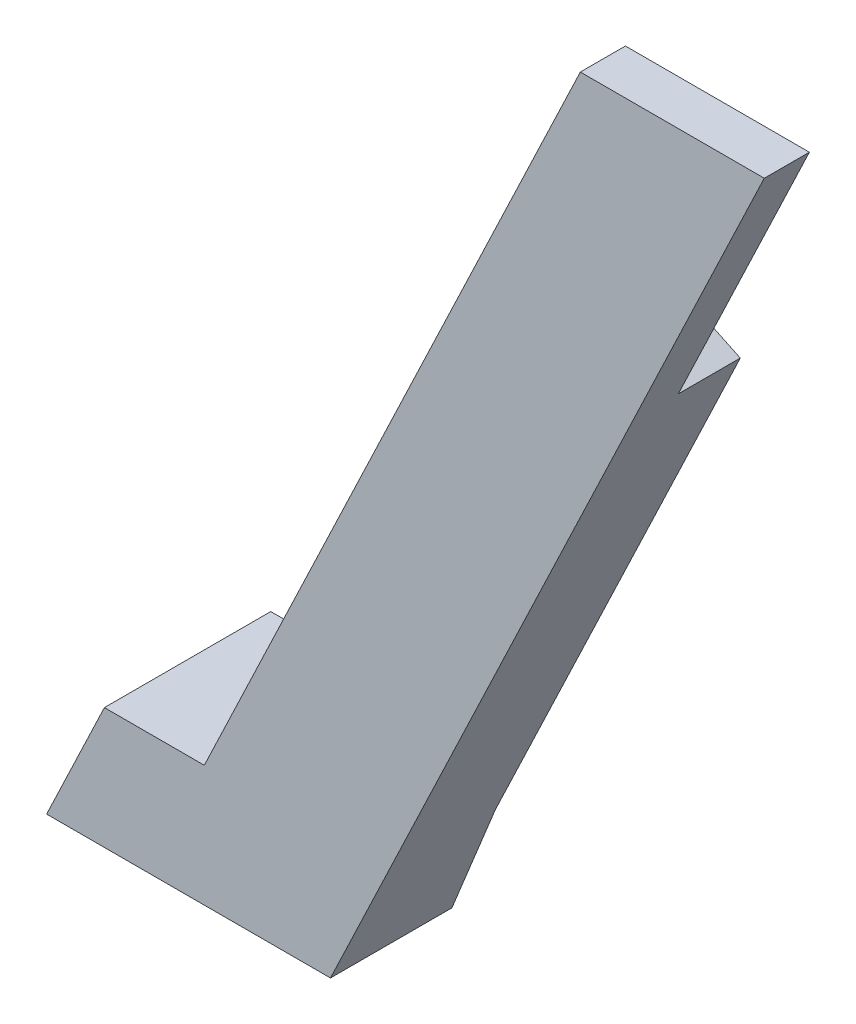
ISO-10303-21;
HEADER;
FILE_DESCRIPTION(('STEP AP214'),'2;1');
FILE_NAME('part.step','',(''),(''),'','','');
FILE_SCHEMA(('AUTOMOTIVE_DESIGN { 1 0 10303 214 1 1 1 1 }'));
ENDSEC;
DATA;
#1=APPLICATION_CONTEXT('core data for automotive mechanical design processes');
#2=APPLICATION_PROTOCOL_DEFINITION('international standard','automotive_design',2000,#1);
#3=PRODUCT_CONTEXT('',#1,'mechanical');
#4=PRODUCT('Part','Part','',(#3));
#5=PRODUCT_RELATED_PRODUCT_CATEGORY('part','',(#4));
#6=PRODUCT_DEFINITION_FORMATION('','',#4);
#7=PRODUCT_DEFINITION_CONTEXT('part definition',#1,'design');
#8=PRODUCT_DEFINITION('design','',#6,#7);
#9=PRODUCT_DEFINITION_SHAPE('','',#8);
#10=(LENGTH_UNIT() NAMED_UNIT(*) SI_UNIT(.MILLI.,.METRE.));
#11=(NAMED_UNIT(*) PLANE_ANGLE_UNIT() SI_UNIT($,.RADIAN.));
#12=(NAMED_UNIT(*) SI_UNIT($,.STERADIAN.) SOLID_ANGLE_UNIT());
#13=UNCERTAINTY_MEASURE_WITH_UNIT(LENGTH_MEASURE(1.E-05),#10,'distance_accuracy_value','');
#14=(GEOMETRIC_REPRESENTATION_CONTEXT(3) GLOBAL_UNCERTAINTY_ASSIGNED_CONTEXT((#13)) GLOBAL_UNIT_ASSIGNED_CONTEXT((#10,
#11,#12)) REPRESENTATION_CONTEXT('',''));
#15=CARTESIAN_POINT('',(0.,0.,0.));
#16=DIRECTION('',(0.,0.,1.));
#17=DIRECTION('',(1.,0.,0.));
#18=AXIS2_PLACEMENT_3D('',#15,#16,#17);
#19=CARTESIAN_POINT('',(0.,0.,-4.));
#20=DIRECTION('',(0.,0.,1.));
#21=DIRECTION('',(1.,0.,0.));
#22=AXIS2_PLACEMENT_3D('',#19,#20,#21);
#23=PLANE('',#22);
#24=DIRECTION('',(0.902585284349863,-0.430511096808291,0.));
#25=VECTOR('',#24,1.);
#26=CARTESIAN_POINT('',(4.57342261183424,9.58837990276632,-4.));
#27=LINE('',#26,#25);
#28=CARTESIAN_POINT('',(-5.21888141705454,14.2590693332878,-4.));
#29=VERTEX_POINT('',#28);
#30=CARTESIAN_POINT('',(-0.164403824695319,11.8482071911614,-4.));
#31=VERTEX_POINT('',#30);
#32=EDGE_CURVE('E302',#29,#31,#27,.T.);
#33=ORIENTED_EDGE('',*,*,#32,.T.);
#34=DIRECTION('',(0.430511096808289,0.902585284349863,0.));
#35=VECTOR('',#34,1.);
#36=CARTESIAN_POINT('',(-4.73782643652955,2.25982728839507,-4.));
#37=LINE('',#36,#35);
#38=CARTESIAN_POINT('',(4.31291158211089,21.2350941484,-4.));
#39=VERTEX_POINT('',#38);
#40=EDGE_CURVE('E99',#31,#39,#37,.T.);
#41=ORIENTED_EDGE('',*,*,#40,.T.);
#42=DIRECTION('',(-0.902585284349863,0.430511096808291,0.));
#43=VECTOR('',#42,1.);
#44=CARTESIAN_POINT('',(9.05073801864047,18.9752668600049,-4.));
#45=LINE('',#44,#43);
#46=CARTESIAN_POINT('',(-0.741566010248357,23.6459562905264,-4.));
#47=VERTEX_POINT('',#46);
#48=EDGE_CURVE('E308',#39,#47,#45,.T.);
#49=ORIENTED_EDGE('',*,*,#48,.T.);
#50=DIRECTION('',(-0.430511096808287,-0.902585284349865,0.));
#51=VECTOR('',#50,1.);
#52=CARTESIAN_POINT('',(-9.79230402888876,4.67068943052144,-4.));
#53=LINE('',#52,#51);
#54=EDGE_CURVE('E301',#47,#29,#53,.T.);
#55=ORIENTED_EDGE('',*,*,#54,.T.);
#56=EDGE_LOOP('',(#33,#41,#49,#55));
#57=FACE_BOUND('',#56,.T.);
#58=DIRECTION('',(0.902585284349865,-0.430511096808287,0.));
#59=VECTOR('',#58,1.);
#60=CARTESIAN_POINT('',(3.28188932140938,6.88062404971684,-4.));
#61=LINE('',#60,#59);
#62=CARTESIAN_POINT('',(-8.81560558331229,12.6508331262096,-4.));
#63=VERTEX_POINT('',#62);
#64=CARTESIAN_POINT('',(1.25181873792912,7.84891804768718,-4.));
#65=VERTEX_POINT('',#64);
#66=EDGE_CURVE('E256',#63,#65,#61,.T.);
#67=ORIENTED_EDGE('',*,*,#66,.F.);
#68=DIRECTION('',(-0.43051109680829,-0.902585284349863,0.));
#69=VECTOR('',#68,1.);
#70=CARTESIAN_POINT('',(6.79806732335556,45.3855791169411,-4.));
#71=LINE('',#70,#69);
#72=CARTESIAN_POINT('',(6.79806732335556,45.3855791169411,-4.));
#73=VERTEX_POINT('',#72);
#74=EDGE_CURVE('E222',#73,#63,#71,.T.);
#75=ORIENTED_EDGE('',*,*,#74,.F.);
#76=DIRECTION('',(-1.,0.,0.));
#77=VECTOR('',#76,1.);
#78=CARTESIAN_POINT('',(6.79806732335556,45.3855791169411,-4.));
#79=LINE('',#78,#77);
#80=CARTESIAN_POINT('',(23.1199205917161,45.3855791169411,-4.));
#81=VERTEX_POINT('',#80);
#82=EDGE_CURVE('E227',#81,#73,#79,.T.);
#83=ORIENTED_EDGE('',*,*,#82,.F.);
#84=DIRECTION('',(0.430511096808289,0.902585284349863,0.));
#85=VECTOR('',#84,1.);
#86=CARTESIAN_POINT('',(-15.3714022019898,-35.3131573066409,-4.));
#87=LINE('',#86,#85);
#88=CARTESIAN_POINT('',(11.4902633590119,21.0034956861254,-4.));
#89=VERTEX_POINT('',#88);
#90=EDGE_CURVE('E217',#89,#81,#87,.T.);
#91=ORIENTED_EDGE('',*,*,#90,.F.);
#92=DIRECTION('',(0.902585284349863,-0.43051109680829,0.));
#93=VECTOR('',#92,1.);
#94=CARTESIAN_POINT('',(10.290994088802,21.5755177851323,-4.));
#95=LINE('',#94,#93);
#96=CARTESIAN_POINT('',(8.26092366574488,22.5438117065847,-4.));
#97=VERTEX_POINT('',#96);
#98=EDGE_CURVE('E259',#97,#89,#95,.T.);
#99=ORIENTED_EDGE('',*,*,#98,.F.);
#100=DIRECTION('',(0.430511106661755,0.902585279650001,0.));
#101=VECTOR('',#100,1.);
#102=CARTESIAN_POINT('',(-2.0300706480248,0.96829405596068,-4.));
#103=LINE('',#102,#101);
#104=EDGE_CURVE('E251',#65,#97,#103,.T.);
#105=ORIENTED_EDGE('',*,*,#104,.F.);
#106=EDGE_LOOP('',(#67,#75,#83,#91,#99,#105));
#107=FACE_BOUND('',#106,.T.);
#108=ADVANCED_FACE('F77',(#57,#107),#23,.F.);
#109=CARTESIAN_POINT('',(6.79806732335556,45.3855791169411,-4.));
#110=DIRECTION('',(0.,1.,0.));
#111=DIRECTION('',(0.,0.,1.));
#112=AXIS2_PLACEMENT_3D('',#109,#110,#111);
#113=PLANE('',#112);
#114=DIRECTION('',(-1.,0.,0.));
#115=VECTOR('',#114,1.);
#116=CARTESIAN_POINT('',(6.79806732335556,45.3855791169411,0.));
#117=LINE('',#116,#115);
#118=CARTESIAN_POINT('',(23.1199205917161,45.3855791169411,0.));
#119=VERTEX_POINT('',#118);
#120=CARTESIAN_POINT('',(6.79806732335556,45.3855791169411,0.));
#121=VERTEX_POINT('',#120);
#122=EDGE_CURVE('E231',#119,#121,#117,.T.);
#123=ORIENTED_EDGE('',*,*,#122,.F.);
#124=DIRECTION('',(0.,0.,1.));
#125=VECTOR('',#124,1.);
#126=CARTESIAN_POINT('',(23.1199205917161,45.3855791169411,-4.));
#127=LINE('',#126,#125);
#128=EDGE_CURVE('E206',#81,#119,#127,.T.);
#129=ORIENTED_EDGE('',*,*,#128,.F.);
#130=ORIENTED_EDGE('',*,*,#82,.T.);
#131=DIRECTION('',(0.,0.,1.));
#132=VECTOR('',#131,1.);
#133=CARTESIAN_POINT('',(6.79806732335556,45.3855791169411,-4.));
#134=LINE('',#133,#132);
#135=EDGE_CURVE('E216',#73,#121,#134,.T.);
#136=ORIENTED_EDGE('',*,*,#135,.T.);
#137=EDGE_LOOP('',(#123,#129,#130,#136));
#138=FACE_BOUND('',#137,.T.);
#139=ADVANCED_FACE('F79',(#138),#113,.T.);
#140=CARTESIAN_POINT('',(-15.3714022019898,-35.3131573066409,-4.));
#141=DIRECTION('',(0.902585284349863,-0.430511096808289,0.));
#142=DIRECTION('',(0.430511096808289,0.902585284349863,0.));
#143=AXIS2_PLACEMENT_3D('',#140,#141,#142);
#144=PLANE('',#143);
#145=DIRECTION('',(-0.428076885082601,-0.897481853337546,-0.10619088184859));
#146=VECTOR('',#145,1.);
#147=CARTESIAN_POINT('',(-15.0635706334285,-34.6677750019764,-10.6954381913424));
#148=LINE('',#147,#146);
#149=CARTESIAN_POINT('',(-10.2445179205198,-24.564420883059,-9.5));
#150=VERTEX_POINT('',#149);
#151=CARTESIAN_POINT('',(-15.3714022019898,-35.3131573066409,-10.7718004217395));
#152=VERTEX_POINT('',#151);
#153=EDGE_CURVE('E185',#150,#152,#148,.T.);
#154=ORIENTED_EDGE('',*,*,#153,.F.);
#155=DIRECTION('',(-0.430511096808289,-0.902585284349864,0.));
#156=VECTOR('',#155,1.);
#157=CARTESIAN_POINT('',(1.19926927021,-0.572022099006938,-9.50000000000001));
#158=LINE('',#157,#156);
#159=CARTESIAN_POINT('',(11.4902633590119,21.0034956861254,-9.50000000000001));
#160=VERTEX_POINT('',#159);
#161=EDGE_CURVE('E272',#160,#150,#158,.T.);
#162=ORIENTED_EDGE('',*,*,#161,.F.);
#163=DIRECTION('',(0.,0.,1.));
#164=VECTOR('',#163,1.);
#165=CARTESIAN_POINT('',(11.4902633590119,21.0034956861254,-87.3223205408676));
#166=LINE('',#165,#164);
#167=EDGE_CURVE('E257',#160,#89,#166,.T.);
#168=ORIENTED_EDGE('',*,*,#167,.T.);
#169=ORIENTED_EDGE('',*,*,#90,.T.);
#170=ORIENTED_EDGE('',*,*,#128,.T.);
#171=DIRECTION('',(0.430511096808289,0.902585284349863,0.));
#172=VECTOR('',#171,1.);
#173=CARTESIAN_POINT('',(-15.3714022019898,-35.3131573066409,0.));
#174=LINE('',#173,#172);
#175=CARTESIAN_POINT('',(-15.3714022019898,-35.3131573066409,0.));
#176=VERTEX_POINT('',#175);
#177=EDGE_CURVE('E205',#176,#119,#174,.T.);
#178=ORIENTED_EDGE('',*,*,#177,.F.);
#179=DIRECTION('',(0.,0.,1.));
#180=VECTOR('',#179,1.);
#181=CARTESIAN_POINT('',(-15.3714022019898,-35.3131573066409,-4.));
#182=LINE('',#181,#180);
#183=EDGE_CURVE('E198',#152,#176,#182,.T.);
#184=ORIENTED_EDGE('',*,*,#183,.F.);
#185=EDGE_LOOP('',(#154,#162,#168,#169,#170,#178,#184));
#186=FACE_BOUND('',#185,.T.);
#187=ADVANCED_FACE('F203',(#186),#144,.T.);
#188=CARTESIAN_POINT('',(-40.55668382301,-35.3131573066409,-4.));
#189=DIRECTION('',(0.,-1.,0.));
#190=DIRECTION('',(0.,0.,-1.));
#191=AXIS2_PLACEMENT_3D('',#188,#189,#190);
#192=PLANE('',#191);
#193=DIRECTION('',(-0.970582796133083,0.,-0.240767597177209));
#194=VECTOR('',#193,1.);
#195=CARTESIAN_POINT('',(-31.4486399349221,-35.3131573066409,-14.76));
#196=LINE('',#195,#194);
#197=CARTESIAN_POINT('',(-31.4486399349221,-35.313157306641,-14.76));
#198=VERTEX_POINT('',#197);
#199=EDGE_CURVE('E91',#152,#198,#196,.T.);
#200=ORIENTED_EDGE('',*,*,#199,.F.);
#201=ORIENTED_EDGE('',*,*,#183,.T.);
#202=DIRECTION('',(1.,0.,0.));
#203=VECTOR('',#202,1.);
#204=CARTESIAN_POINT('',(-40.55668382301,-35.3131573066409,0.));
#205=LINE('',#204,#203);
#206=CARTESIAN_POINT('',(-40.55668382301,-35.3131573066409,0.));
#207=VERTEX_POINT('',#206);
#208=EDGE_CURVE('E244',#207,#176,#205,.T.);
#209=ORIENTED_EDGE('',*,*,#208,.F.);
#210=DIRECTION('',(0.,0.,1.));
#211=VECTOR('',#210,1.);
#212=CARTESIAN_POINT('',(-40.55668382301,-35.3131573066409,-4.));
#213=LINE('',#212,#211);
#214=CARTESIAN_POINT('',(-40.55668382301,-35.313157306641,-14.76));
#215=VERTEX_POINT('',#214);
#216=EDGE_CURVE('E207',#215,#207,#213,.T.);
#217=ORIENTED_EDGE('',*,*,#216,.F.);
#218=DIRECTION('',(-1.,0.,0.));
#219=VECTOR('',#218,1.);
#220=CARTESIAN_POINT('',(-15.3714022019898,-35.3131573066409,-14.76));
#221=LINE('',#220,#219);
#222=EDGE_CURVE('E192',#198,#215,#221,.T.);
#223=ORIENTED_EDGE('',*,*,#222,.F.);
#224=EDGE_LOOP('',(#200,#201,#209,#217,#223));
#225=FACE_BOUND('',#224,.T.);
#226=ADVANCED_FACE('F196',(#225),#192,.T.);
#227=CARTESIAN_POINT('',(-35.4297995415399,-24.564420883059,-4.));
#228=DIRECTION('',(-0.902585284349863,0.43051109680829,0.));
#229=DIRECTION('',(-0.43051109680829,-0.902585284349863,0.));
#230=AXIS2_PLACEMENT_3D('',#227,#228,#229);
#231=PLANE('',#230);
#232=DIRECTION('',(-0.430511096808289,-0.902585284349863,0.));
#233=VECTOR('',#232,1.);
#234=CARTESIAN_POINT('',(-35.4297995415399,-24.564420883059,0.));
#235=LINE('',#234,#233);
#236=CARTESIAN_POINT('',(-35.4297995415399,-24.564420883059,0.));
#237=VERTEX_POINT('',#236);
#238=EDGE_CURVE('E241',#237,#207,#235,.T.);
#239=ORIENTED_EDGE('',*,*,#238,.F.);
#240=DIRECTION('',(0.,0.,1.));
#241=VECTOR('',#240,1.);
#242=CARTESIAN_POINT('',(-35.4297995415399,-24.564420883059,-4.));
#243=LINE('',#242,#241);
#244=CARTESIAN_POINT('',(-35.4297995415399,-24.564420883059,-14.76));
#245=VERTEX_POINT('',#244);
#246=EDGE_CURVE('E210',#245,#237,#243,.T.);
#247=ORIENTED_EDGE('',*,*,#246,.F.);
#248=DIRECTION('',(0.430511096808289,0.902585284349863,0.));
#249=VECTOR('',#248,1.);
#250=CARTESIAN_POINT('',(-40.55668382301,-35.313157306641,-14.76));
#251=LINE('',#250,#249);
#252=EDGE_CURVE('E316',#215,#245,#251,.T.);
#253=ORIENTED_EDGE('',*,*,#252,.F.);
#254=ORIENTED_EDGE('',*,*,#216,.T.);
#255=EDGE_LOOP('',(#239,#247,#253,#254));
#256=FACE_BOUND('',#255,.T.);
#257=ADVANCED_FACE('F326',(#256),#231,.T.);
#258=CARTESIAN_POINT('',(-26.5663711888802,-24.564420883059,-4.));
#259=DIRECTION('',(0.,1.,0.));
#260=DIRECTION('',(0.,0.,1.));
#261=AXIS2_PLACEMENT_3D('',#258,#259,#260);
#262=PLANE('',#261);
#263=DIRECTION('',(0.970582796133083,0.,0.240767597177209));
#264=VECTOR('',#263,1.);
#265=CARTESIAN_POINT('',(-24.3349422093445,-24.564420883059,-12.9953407506747));
#266=LINE('',#265,#264);
#267=CARTESIAN_POINT('',(-31.4486399349221,-24.564420883059,-14.76));
#268=VERTEX_POINT('',#267);
#269=EDGE_CURVE('E188',#268,#150,#266,.T.);
#270=ORIENTED_EDGE('',*,*,#269,.F.);
#271=DIRECTION('',(1.,0.,0.));
#272=VECTOR('',#271,1.);
#273=CARTESIAN_POINT('',(-35.4297995415399,-24.564420883059,-14.76));
#274=LINE('',#273,#272);
#275=EDGE_CURVE('E305',#245,#268,#274,.T.);
#276=ORIENTED_EDGE('',*,*,#275,.F.);
#277=ORIENTED_EDGE('',*,*,#246,.T.);
#278=DIRECTION('',(-1.,0.,0.));
#279=VECTOR('',#278,1.);
#280=CARTESIAN_POINT('',(-26.5663711888802,-24.564420883059,0.));
#281=LINE('',#280,#279);
#282=CARTESIAN_POINT('',(-26.5663711888802,-24.564420883059,0.));
#283=VERTEX_POINT('',#282);
#284=EDGE_CURVE('E238',#283,#237,#281,.T.);
#285=ORIENTED_EDGE('',*,*,#284,.F.);
#286=DIRECTION('',(0.,0.,1.));
#287=VECTOR('',#286,1.);
#288=CARTESIAN_POINT('',(-26.5663711888802,-24.564420883059,-4.));
#289=LINE('',#288,#287);
#290=CARTESIAN_POINT('',(-26.5663711888802,-24.564420883059,-9.50000000000001));
#291=VERTEX_POINT('',#290);
#292=EDGE_CURVE('E215',#291,#283,#289,.T.);
#293=ORIENTED_EDGE('',*,*,#292,.F.);
#294=DIRECTION('',(1.,0.,0.));
#295=VECTOR('',#294,1.);
#296=CARTESIAN_POINT('',(-35.4297995415399,-24.564420883059,-9.5));
#297=LINE('',#296,#295);
#298=EDGE_CURVE('E85',#291,#150,#297,.T.);
#299=ORIENTED_EDGE('',*,*,#298,.T.);
#300=EDGE_LOOP('',(#270,#276,#277,#285,#293,#299));
#301=FACE_BOUND('',#300,.T.);
#302=ADVANCED_FACE('F329',(#301),#262,.T.);
#303=CARTESIAN_POINT('',(6.79806732335556,45.3855791169411,-4.));
#304=DIRECTION('',(-0.902585284349863,0.43051109680829,0.));
#305=DIRECTION('',(-0.43051109680829,-0.902585284349863,0.));
#306=AXIS2_PLACEMENT_3D('',#303,#304,#305);
#307=PLANE('',#306);
#308=DIRECTION('',(-0.43051109680829,-0.902585284349863,0.));
#309=VECTOR('',#308,1.);
#310=CARTESIAN_POINT('',(6.79806732335556,45.3855791169411,0.));
#311=LINE('',#310,#309);
#312=EDGE_CURVE('E234',#121,#283,#311,.T.);
#313=ORIENTED_EDGE('',*,*,#312,.F.);
#314=ORIENTED_EDGE('',*,*,#135,.F.);
#315=ORIENTED_EDGE('',*,*,#74,.T.);
#316=DIRECTION('',(0.,0.,1.));
#317=VECTOR('',#316,1.);
#318=CARTESIAN_POINT('',(-8.81560558331229,12.6508331262096,-87.3223205408676));
#319=LINE('',#318,#317);
#320=CARTESIAN_POINT('',(-8.81560558331229,12.6508331262096,-9.50000000000001));
#321=VERTEX_POINT('',#320);
#322=EDGE_CURVE('E253',#321,#63,#319,.T.);
#323=ORIENTED_EDGE('',*,*,#322,.F.);
#324=DIRECTION('',(0.43051109680829,0.902585284349863,0.));
#325=VECTOR('',#324,1.);
#326=CARTESIAN_POINT('',(-12.0974949047217,5.77020907649281,-9.50000000000001));
#327=LINE('',#326,#325);
#328=EDGE_CURVE('E235',#291,#321,#327,.T.);
#329=ORIENTED_EDGE('',*,*,#328,.F.);
#330=ORIENTED_EDGE('',*,*,#292,.T.);
#331=EDGE_LOOP('',(#313,#314,#315,#323,#329,#330));
#332=FACE_BOUND('',#331,.T.);
#333=ADVANCED_FACE('F341',(#332),#307,.T.);
#334=CARTESIAN_POINT('',(0.,0.,0.));
#335=DIRECTION('',(0.,0.,1.));
#336=DIRECTION('',(1.,0.,0.));
#337=AXIS2_PLACEMENT_3D('',#334,#335,#336);
#338=PLANE('',#337);
#339=ORIENTED_EDGE('',*,*,#122,.T.);
#340=ORIENTED_EDGE('',*,*,#312,.T.);
#341=ORIENTED_EDGE('',*,*,#284,.T.);
#342=ORIENTED_EDGE('',*,*,#238,.T.);
#343=ORIENTED_EDGE('',*,*,#208,.T.);
#344=ORIENTED_EDGE('',*,*,#177,.T.);
#345=EDGE_LOOP('',(#339,#340,#341,#342,#343,#344));
#346=FACE_BOUND('',#345,.T.);
#347=ADVANCED_FACE('F349',(#346),#338,.T.);
#348=CARTESIAN_POINT('',(-2.0300706480248,0.96829405596068,-87.3223205408676));
#349=DIRECTION('',(0.902585279650001,-0.430511106661755,0.));
#350=DIRECTION('',(0.430511106661755,0.902585279650001,0.));
#351=AXIS2_PLACEMENT_3D('',#348,#349,#350);
#352=PLANE('',#351);
#353=DIRECTION('',(0.430511106661755,0.902585279650001,0.));
#354=VECTOR('',#353,1.);
#355=CARTESIAN_POINT('',(-2.0300706480248,0.96829405596068,-9.50000000000001));
#356=LINE('',#355,#354);
#357=CARTESIAN_POINT('',(1.25181873792912,7.84891804768718,-9.50000000000001));
#358=VERTEX_POINT('',#357);
#359=CARTESIAN_POINT('',(8.26092366574488,22.5438117065847,-9.50000000000001));
#360=VERTEX_POINT('',#359);
#361=EDGE_CURVE('E266',#358,#360,#356,.T.);
#362=ORIENTED_EDGE('',*,*,#361,.F.);
#363=DIRECTION('',(0.,0.,1.));
#364=VECTOR('',#363,1.);
#365=CARTESIAN_POINT('',(1.25181873792912,7.84891804768718,-87.3223205408676));
#366=LINE('',#365,#364);
#367=EDGE_CURVE('E248',#358,#65,#366,.T.);
#368=ORIENTED_EDGE('',*,*,#367,.T.);
#369=ORIENTED_EDGE('',*,*,#104,.T.);
#370=DIRECTION('',(0.,0.,1.));
#371=VECTOR('',#370,1.);
#372=CARTESIAN_POINT('',(8.26092366574488,22.5438117065847,-87.3223205408676));
#373=LINE('',#372,#371);
#374=EDGE_CURVE('E260',#360,#97,#373,.T.);
#375=ORIENTED_EDGE('',*,*,#374,.F.);
#376=EDGE_LOOP('',(#362,#368,#369,#375));
#377=FACE_BOUND('',#376,.T.);
#378=ADVANCED_FACE('F347',(#377),#352,.F.);
#379=CARTESIAN_POINT('',(10.290994088802,21.5755177851323,-87.3223205408676));
#380=DIRECTION('',(-0.43051109680829,-0.902585284349863,0.));
#381=DIRECTION('',(0.902585284349863,-0.43051109680829,0.));
#382=AXIS2_PLACEMENT_3D('',#379,#380,#381);
#383=PLANE('',#382);
#384=DIRECTION('',(0.902585284349863,-0.43051109680829,0.));
#385=VECTOR('',#384,1.);
#386=CARTESIAN_POINT('',(10.290994088802,21.5755177851323,-9.50000000000001));
#387=LINE('',#386,#385);
#388=EDGE_CURVE('E269',#360,#160,#387,.T.);
#389=ORIENTED_EDGE('',*,*,#388,.F.);
#390=ORIENTED_EDGE('',*,*,#374,.T.);
#391=ORIENTED_EDGE('',*,*,#98,.T.);
#392=ORIENTED_EDGE('',*,*,#167,.F.);
#393=EDGE_LOOP('',(#389,#390,#391,#392));
#394=FACE_BOUND('',#393,.T.);
#395=ADVANCED_FACE('F336',(#394),#383,.F.);
#396=CARTESIAN_POINT('',(3.28188932140938,6.88062404971684,-87.3223205408676));
#397=DIRECTION('',(-0.430511096808287,-0.902585284349865,0.));
#398=DIRECTION('',(0.902585284349865,-0.430511096808287,0.));
#399=AXIS2_PLACEMENT_3D('',#396,#397,#398);
#400=PLANE('',#399);
#401=DIRECTION('',(0.902585284349865,-0.430511096808287,0.));
#402=VECTOR('',#401,1.);
#403=CARTESIAN_POINT('',(3.28188932140938,6.88062404971684,-9.50000000000001));
#404=LINE('',#403,#402);
#405=EDGE_CURVE('E263',#321,#358,#404,.T.);
#406=ORIENTED_EDGE('',*,*,#405,.F.);
#407=ORIENTED_EDGE('',*,*,#322,.T.);
#408=ORIENTED_EDGE('',*,*,#66,.T.);
#409=ORIENTED_EDGE('',*,*,#367,.F.);
#410=EDGE_LOOP('',(#406,#407,#408,#409));
#411=FACE_BOUND('',#410,.T.);
#412=ADVANCED_FACE('F344',(#411),#400,.F.);
#413=CARTESIAN_POINT('',(213.987439478169,-44.7724938473252,-9.5));
#414=DIRECTION('',(0.,0.,-1.));
#415=DIRECTION('',(1.,0.,0.));
#416=AXIS2_PLACEMENT_3D('',#413,#414,#415);
#417=PLANE('',#416);
#418=ORIENTED_EDGE('',*,*,#161,.T.);
#419=ORIENTED_EDGE('',*,*,#298,.F.);
#420=ORIENTED_EDGE('',*,*,#328,.T.);
#421=ORIENTED_EDGE('',*,*,#405,.T.);
#422=ORIENTED_EDGE('',*,*,#361,.T.);
#423=ORIENTED_EDGE('',*,*,#388,.T.);
#424=EDGE_LOOP('',(#418,#419,#420,#421,#422,#423));
#425=FACE_BOUND('',#424,.T.);
#426=ADVANCED_FACE('F333',(#425),#417,.T.);
#427=CARTESIAN_POINT('',(213.987439478169,-44.7724938473252,-9.5));
#428=DIRECTION('',(0.,0.,-1.));
#429=DIRECTION('',(1.,0.,0.));
#430=AXIS2_PLACEMENT_3D('',#427,#428,#429);
#431=PLANE('',#430);
#432=DIRECTION('',(0.902585284349863,-0.430511096808291,0.));
#433=VECTOR('',#432,1.);
#434=CARTESIAN_POINT('',(4.57342261183424,9.58837990276632,-9.50000000000001));
#435=LINE('',#434,#433);
#436=CARTESIAN_POINT('',(-5.21888141705454,14.2590693332878,-9.50000000000001));
#437=VERTEX_POINT('',#436);
#438=CARTESIAN_POINT('',(-0.164403824695319,11.8482071911614,-9.50000000000001));
#439=VERTEX_POINT('',#438);
#440=EDGE_CURVE('E283',#437,#439,#435,.T.);
#441=ORIENTED_EDGE('',*,*,#440,.F.);
#442=DIRECTION('',(-0.430511096808287,-0.902585284349865,0.));
#443=VECTOR('',#442,1.);
#444=CARTESIAN_POINT('',(-9.79230402888876,4.67068943052144,-9.50000000000001));
#445=LINE('',#444,#443);
#446=CARTESIAN_POINT('',(-0.741566010248357,23.6459562905264,-9.50000000000001));
#447=VERTEX_POINT('',#446);
#448=EDGE_CURVE('E290',#447,#437,#445,.T.);
#449=ORIENTED_EDGE('',*,*,#448,.F.);
#450=DIRECTION('',(-0.902585284349863,0.430511096808291,0.));
#451=VECTOR('',#450,1.);
#452=CARTESIAN_POINT('',(9.05073801864047,18.9752668600049,-9.50000000000001));
#453=LINE('',#452,#451);
#454=CARTESIAN_POINT('',(4.31291158211089,21.2350941484,-9.50000000000001));
#455=VERTEX_POINT('',#454);
#456=EDGE_CURVE('E286',#455,#447,#453,.T.);
#457=ORIENTED_EDGE('',*,*,#456,.F.);
#458=DIRECTION('',(0.43051109680829,0.902585284349864,0.));
#459=VECTOR('',#458,1.);
#460=CARTESIAN_POINT('',(-4.73782643652955,2.25982728839507,-9.50000000000001));
#461=LINE('',#460,#459);
#462=EDGE_CURVE('E287',#439,#455,#461,.T.);
#463=ORIENTED_EDGE('',*,*,#462,.F.);
#464=EDGE_LOOP('',(#441,#449,#457,#463));
#465=FACE_BOUND('',#464,.T.);
#466=ADVANCED_FACE('F420',(#465),#431,.T.);
#467=CARTESIAN_POINT('',(-4.73782643652955,2.25982728839507,-87.3223205408676));
#468=DIRECTION('',(0.902585284349863,-0.430511096808289,0.));
#469=DIRECTION('',(0.43051109680829,0.902585284349864,0.));
#470=AXIS2_PLACEMENT_3D('',#467,#468,#469);
#471=PLANE('',#470);
#472=DIRECTION('',(0.,0.,1.));
#473=VECTOR('',#472,1.);
#474=CARTESIAN_POINT('',(-0.164403824695319,11.8482071911614,-87.3223205408676));
#475=LINE('',#474,#473);
#476=EDGE_CURVE('E252',#439,#31,#475,.T.);
#477=ORIENTED_EDGE('',*,*,#476,.F.);
#478=ORIENTED_EDGE('',*,*,#462,.T.);
#479=DIRECTION('',(0.,0.,1.));
#480=VECTOR('',#479,1.);
#481=CARTESIAN_POINT('',(4.31291158211089,21.2350941484,-87.3223205408676));
#482=LINE('',#481,#480);
#483=EDGE_CURVE('E284',#455,#39,#482,.T.);
#484=ORIENTED_EDGE('',*,*,#483,.T.);
#485=ORIENTED_EDGE('',*,*,#40,.F.);
#486=EDGE_LOOP('',(#477,#478,#484,#485));
#487=FACE_BOUND('',#486,.T.);
#488=ADVANCED_FACE('F425',(#487),#471,.T.);
#489=CARTESIAN_POINT('',(9.05073801864047,18.9752668600049,-87.3223205408676));
#490=DIRECTION('',(0.430511096808291,0.902585284349863,0.));
#491=DIRECTION('',(-0.902585284349863,0.430511096808291,0.));
#492=AXIS2_PLACEMENT_3D('',#489,#490,#491);
#493=PLANE('',#492);
#494=ORIENTED_EDGE('',*,*,#483,.F.);
#495=ORIENTED_EDGE('',*,*,#456,.T.);
#496=DIRECTION('',(0.,0.,1.));
#497=VECTOR('',#496,1.);
#498=CARTESIAN_POINT('',(-0.741566010248357,23.6459562905264,-87.3223205408676));
#499=LINE('',#498,#497);
#500=EDGE_CURVE('E288',#447,#47,#499,.T.);
#501=ORIENTED_EDGE('',*,*,#500,.T.);
#502=ORIENTED_EDGE('',*,*,#48,.F.);
#503=EDGE_LOOP('',(#494,#495,#501,#502));
#504=FACE_BOUND('',#503,.T.);
#505=ADVANCED_FACE('F436',(#504),#493,.T.);
#506=CARTESIAN_POINT('',(-9.79230402888876,4.67068943052144,-87.3223205408676));
#507=DIRECTION('',(-0.902585284349865,0.430511096808287,0.));
#508=DIRECTION('',(-0.430511096808287,-0.902585284349865,0.));
#509=AXIS2_PLACEMENT_3D('',#506,#507,#508);
#510=PLANE('',#509);
#511=ORIENTED_EDGE('',*,*,#500,.F.);
#512=ORIENTED_EDGE('',*,*,#448,.T.);
#513=DIRECTION('',(0.,0.,1.));
#514=VECTOR('',#513,1.);
#515=CARTESIAN_POINT('',(-5.21888141705454,14.2590693332878,-87.3223205408676));
#516=LINE('',#515,#514);
#517=EDGE_CURVE('E291',#437,#29,#516,.T.);
#518=ORIENTED_EDGE('',*,*,#517,.T.);
#519=ORIENTED_EDGE('',*,*,#54,.F.);
#520=EDGE_LOOP('',(#511,#512,#518,#519));
#521=FACE_BOUND('',#520,.T.);
#522=ADVANCED_FACE('F446',(#521),#510,.T.);
#523=CARTESIAN_POINT('',(4.57342261183424,9.58837990276632,-87.3223205408676));
#524=DIRECTION('',(-0.430511096808291,-0.902585284349863,0.));
#525=DIRECTION('',(0.902585284349863,-0.430511096808291,0.));
#526=AXIS2_PLACEMENT_3D('',#523,#524,#525);
#527=PLANE('',#526);
#528=ORIENTED_EDGE('',*,*,#517,.F.);
#529=ORIENTED_EDGE('',*,*,#440,.T.);
#530=ORIENTED_EDGE('',*,*,#476,.T.);
#531=ORIENTED_EDGE('',*,*,#32,.F.);
#532=EDGE_LOOP('',(#528,#529,#530,#531));
#533=FACE_BOUND('',#532,.T.);
#534=ADVANCED_FACE('F457',(#533),#527,.T.);
#535=CARTESIAN_POINT('',(0.,0.,-14.76));
#536=DIRECTION('',(0.,0.,-1.));
#537=DIRECTION('',(-1.,0.,0.));
#538=AXIS2_PLACEMENT_3D('',#535,#536,#537);
#539=PLANE('',#538);
#540=DIRECTION('',(0.,1.,0.));
#541=VECTOR('',#540,1.);
#542=CARTESIAN_POINT('',(-31.4486399349221,0.,-14.76));
#543=LINE('',#542,#541);
#544=EDGE_CURVE('E12',#198,#268,#543,.T.);
#545=ORIENTED_EDGE('',*,*,#544,.F.);
#546=ORIENTED_EDGE('',*,*,#222,.T.);
#547=ORIENTED_EDGE('',*,*,#252,.T.);
#548=ORIENTED_EDGE('',*,*,#275,.T.);
#549=EDGE_LOOP('',(#545,#546,#547,#548));
#550=FACE_BOUND('',#549,.T.);
#551=ADVANCED_FACE('F321',(#550),#539,.T.);
#552=CARTESIAN_POINT('',(-31.4486399349221,-10.0531573066409,-14.76));
#553=DIRECTION('',(-0.240767597177209,0.,0.970582796133083));
#554=DIRECTION('',(0.970582796133083,0.,0.240767597177209));
#555=AXIS2_PLACEMENT_3D('',#552,#553,#554);
#556=PLANE('',#555);
#557=ORIENTED_EDGE('',*,*,#153,.T.);
#558=ORIENTED_EDGE('',*,*,#199,.T.);
#559=ORIENTED_EDGE('',*,*,#544,.T.);
#560=ORIENTED_EDGE('',*,*,#269,.T.);
#561=EDGE_LOOP('',(#557,#558,#559,#560));
#562=FACE_BOUND('',#561,.T.);
#563=ADVANCED_FACE('F186',(#562),#556,.F.);
#564=CLOSED_SHELL('',(#108,#139,#187,#226,#257,#302,#333,#347,#378,#395,#412,#426,#466,#488,
#505,#522,#534,#551,#563));
#565=MANIFOLD_SOLID_BREP('B2',#564);
#566=ADVANCED_BREP_SHAPE_REPRESENTATION('',(#18,#565),#14);
#567=SHAPE_DEFINITION_REPRESENTATION(#9,#566);
ENDSEC;
END-ISO-10303-21;
